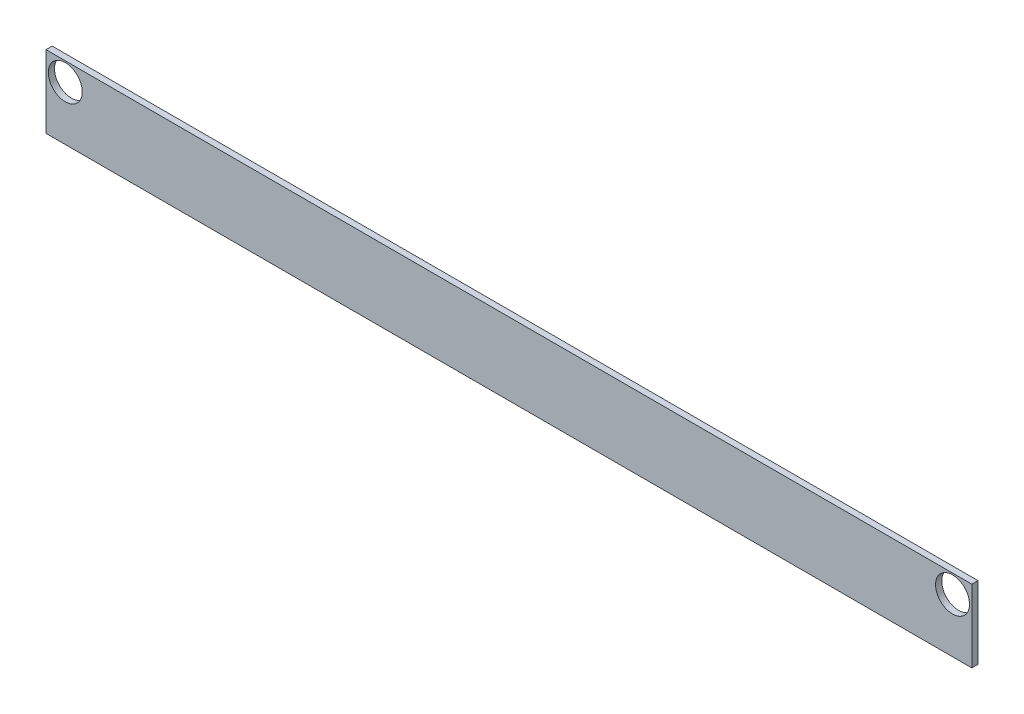
ISO-10303-21;
HEADER;
FILE_DESCRIPTION(('STEP AP214'),'2;1');
FILE_NAME('part.step','',(''),(''),'','','');
FILE_SCHEMA(('AUTOMOTIVE_DESIGN { 1 0 10303 214 1 1 1 1 }'));
ENDSEC;
DATA;
#1=APPLICATION_CONTEXT('core data for automotive mechanical design processes');
#2=APPLICATION_PROTOCOL_DEFINITION('international standard','automotive_design',2000,#1);
#3=PRODUCT_CONTEXT('',#1,'mechanical');
#4=PRODUCT('Part','Part','',(#3));
#5=PRODUCT_RELATED_PRODUCT_CATEGORY('part','',(#4));
#6=PRODUCT_DEFINITION_FORMATION('','',#4);
#7=PRODUCT_DEFINITION_CONTEXT('part definition',#1,'design');
#8=PRODUCT_DEFINITION('design','',#6,#7);
#9=PRODUCT_DEFINITION_SHAPE('','',#8);
#10=(LENGTH_UNIT() NAMED_UNIT(*) SI_UNIT(.MILLI.,.METRE.));
#11=(NAMED_UNIT(*) PLANE_ANGLE_UNIT() SI_UNIT($,.RADIAN.));
#12=(NAMED_UNIT(*) SI_UNIT($,.STERADIAN.) SOLID_ANGLE_UNIT());
#13=UNCERTAINTY_MEASURE_WITH_UNIT(LENGTH_MEASURE(1.E-05),#10,'distance_accuracy_value','');
#14=(GEOMETRIC_REPRESENTATION_CONTEXT(3) GLOBAL_UNCERTAINTY_ASSIGNED_CONTEXT((#13)) GLOBAL_UNIT_ASSIGNED_CONTEXT((#10,
#11,#12)) REPRESENTATION_CONTEXT('',''));
#15=CARTESIAN_POINT('',(0.,0.,0.));
#16=DIRECTION('',(0.,0.,1.));
#17=DIRECTION('',(1.,0.,0.));
#18=AXIS2_PLACEMENT_3D('',#15,#16,#17);
#19=CARTESIAN_POINT('',(300.,-35.,4.));
#20=DIRECTION('',(-1.,0.,0.));
#21=DIRECTION('',(0.,-1.,0.));
#22=AXIS2_PLACEMENT_3D('',#19,#20,#21);
#23=PLANE('',#22);
#24=DIRECTION('',(0.,1.,0.));
#25=VECTOR('',#24,1.);
#26=CARTESIAN_POINT('',(300.,-35.,0.));
#27=LINE('',#26,#25);
#28=CARTESIAN_POINT('',(300.,-35.,0.));
#29=VERTEX_POINT('',#28);
#30=CARTESIAN_POINT('',(300.,12.,0.));
#31=VERTEX_POINT('',#30);
#32=EDGE_CURVE('E115',#29,#31,#27,.T.);
#33=ORIENTED_EDGE('',*,*,#32,.T.);
#34=DIRECTION('',(0.,0.,-1.));
#35=VECTOR('',#34,1.);
#36=CARTESIAN_POINT('',(300.,12.,4.));
#37=LINE('',#36,#35);
#38=CARTESIAN_POINT('',(300.,12.,4.));
#39=VERTEX_POINT('',#38);
#40=EDGE_CURVE('E11',#39,#31,#37,.T.);
#41=ORIENTED_EDGE('',*,*,#40,.F.);
#42=DIRECTION('',(0.,1.,0.));
#43=VECTOR('',#42,1.);
#44=CARTESIAN_POINT('',(300.,-35.,4.));
#45=LINE('',#44,#43);
#46=CARTESIAN_POINT('',(300.,-35.,4.));
#47=VERTEX_POINT('',#46);
#48=EDGE_CURVE('E99',#47,#39,#45,.T.);
#49=ORIENTED_EDGE('',*,*,#48,.F.);
#50=DIRECTION('',(0.,0.,-1.));
#51=VECTOR('',#50,1.);
#52=CARTESIAN_POINT('',(300.,-35.,4.));
#53=LINE('',#52,#51);
#54=EDGE_CURVE('E111',#47,#29,#53,.T.);
#55=ORIENTED_EDGE('',*,*,#54,.T.);
#56=EDGE_LOOP('',(#33,#41,#49,#55));
#57=FACE_BOUND('',#56,.T.);
#58=ADVANCED_FACE('F47',(#57),#23,.F.);
#59=CARTESIAN_POINT('',(-300.,12.,4.));
#60=DIRECTION('',(0.,-1.,0.));
#61=DIRECTION('',(0.,0.,-1.));
#62=AXIS2_PLACEMENT_3D('',#59,#60,#61);
#63=PLANE('',#62);
#64=DIRECTION('',(-1.,0.,0.));
#65=VECTOR('',#64,1.);
#66=CARTESIAN_POINT('',(-300.,12.,0.));
#67=LINE('',#66,#65);
#68=CARTESIAN_POINT('',(-300.,12.,0.));
#69=VERTEX_POINT('',#68);
#70=EDGE_CURVE('E104',#31,#69,#67,.T.);
#71=ORIENTED_EDGE('',*,*,#70,.T.);
#72=DIRECTION('',(0.,0.,-1.));
#73=VECTOR('',#72,1.);
#74=CARTESIAN_POINT('',(-300.,12.,4.));
#75=LINE('',#74,#73);
#76=CARTESIAN_POINT('',(-300.,12.,4.));
#77=VERTEX_POINT('',#76);
#78=EDGE_CURVE('E56',#77,#69,#75,.T.);
#79=ORIENTED_EDGE('',*,*,#78,.F.);
#80=DIRECTION('',(-1.,0.,0.));
#81=VECTOR('',#80,1.);
#82=CARTESIAN_POINT('',(-300.,12.,4.));
#83=LINE('',#82,#81);
#84=EDGE_CURVE('E94',#39,#77,#83,.T.);
#85=ORIENTED_EDGE('',*,*,#84,.F.);
#86=ORIENTED_EDGE('',*,*,#40,.T.);
#87=EDGE_LOOP('',(#71,#79,#85,#86));
#88=FACE_BOUND('',#87,.T.);
#89=ADVANCED_FACE('F103',(#88),#63,.F.);
#90=CARTESIAN_POINT('',(-300.,-35.,4.));
#91=DIRECTION('',(1.,0.,0.));
#92=DIRECTION('',(0.,1.,0.));
#93=AXIS2_PLACEMENT_3D('',#90,#91,#92);
#94=PLANE('',#93);
#95=DIRECTION('',(0.,-1.,0.));
#96=VECTOR('',#95,1.);
#97=CARTESIAN_POINT('',(-300.,-35.,0.));
#98=LINE('',#97,#96);
#99=CARTESIAN_POINT('',(-300.,-35.,0.));
#100=VERTEX_POINT('',#99);
#101=EDGE_CURVE('E81',#69,#100,#98,.T.);
#102=ORIENTED_EDGE('',*,*,#101,.T.);
#103=DIRECTION('',(0.,0.,-1.));
#104=VECTOR('',#103,1.);
#105=CARTESIAN_POINT('',(-300.,-35.,4.));
#106=LINE('',#105,#104);
#107=CARTESIAN_POINT('',(-300.,-35.,4.));
#108=VERTEX_POINT('',#107);
#109=EDGE_CURVE('E106',#108,#100,#106,.T.);
#110=ORIENTED_EDGE('',*,*,#109,.F.);
#111=DIRECTION('',(0.,-1.,0.));
#112=VECTOR('',#111,1.);
#113=CARTESIAN_POINT('',(-300.,-35.,4.));
#114=LINE('',#113,#112);
#115=EDGE_CURVE('E97',#77,#108,#114,.T.);
#116=ORIENTED_EDGE('',*,*,#115,.F.);
#117=ORIENTED_EDGE('',*,*,#78,.T.);
#118=EDGE_LOOP('',(#102,#110,#116,#117));
#119=FACE_BOUND('',#118,.T.);
#120=ADVANCED_FACE('F107',(#119),#94,.F.);
#121=CARTESIAN_POINT('',(-300.,-35.,4.));
#122=DIRECTION('',(0.,1.,0.));
#123=DIRECTION('',(0.,0.,1.));
#124=AXIS2_PLACEMENT_3D('',#121,#122,#123);
#125=PLANE('',#124);
#126=DIRECTION('',(1.,0.,0.));
#127=VECTOR('',#126,1.);
#128=CARTESIAN_POINT('',(-300.,-35.,0.));
#129=LINE('',#128,#127);
#130=EDGE_CURVE('E87',#100,#29,#129,.T.);
#131=ORIENTED_EDGE('',*,*,#130,.T.);
#132=ORIENTED_EDGE('',*,*,#54,.F.);
#133=DIRECTION('',(1.,0.,0.));
#134=VECTOR('',#133,1.);
#135=CARTESIAN_POINT('',(-300.,-35.,4.));
#136=LINE('',#135,#134);
#137=EDGE_CURVE('E64',#108,#47,#136,.T.);
#138=ORIENTED_EDGE('',*,*,#137,.F.);
#139=ORIENTED_EDGE('',*,*,#109,.T.);
#140=EDGE_LOOP('',(#131,#132,#138,#139));
#141=FACE_BOUND('',#140,.T.);
#142=ADVANCED_FACE('F129',(#141),#125,.F.);
#143=CARTESIAN_POINT('',(0.,0.,4.));
#144=DIRECTION('',(0.,0.,-1.));
#145=DIRECTION('',(-1.,0.,0.));
#146=AXIS2_PLACEMENT_3D('',#143,#144,#145);
#147=PLANE('',#146);
#148=CARTESIAN_POINT('',(287.5,0.,4.));
#149=DIRECTION('',(0.,0.,1.));
#150=DIRECTION('',(1.,0.,0.));
#151=AXIS2_PLACEMENT_3D('',#148,#149,#150);
#152=CIRCLE('',#151,11.);
#153=CARTESIAN_POINT('',(298.5,0.,4.));
#154=VERTEX_POINT('',#153);
#155=EDGE_CURVE('E144',#154,#154,#152,.T.);
#156=ORIENTED_EDGE('',*,*,#155,.F.);
#157=EDGE_LOOP('',(#156));
#158=FACE_BOUND('',#157,.T.);
#159=CARTESIAN_POINT('',(-287.5,0.,4.));
#160=DIRECTION('',(0.,0.,1.));
#161=DIRECTION('',(-1.,0.,0.));
#162=AXIS2_PLACEMENT_3D('',#159,#160,#161);
#163=CIRCLE('',#162,11.);
#164=CARTESIAN_POINT('',(-298.5,0.,4.));
#165=VERTEX_POINT('',#164);
#166=EDGE_CURVE('E140',#165,#165,#163,.T.);
#167=ORIENTED_EDGE('',*,*,#166,.F.);
#168=EDGE_LOOP('',(#167));
#169=FACE_BOUND('',#168,.T.);
#170=ORIENTED_EDGE('',*,*,#48,.T.);
#171=ORIENTED_EDGE('',*,*,#84,.T.);
#172=ORIENTED_EDGE('',*,*,#115,.T.);
#173=ORIENTED_EDGE('',*,*,#137,.T.);
#174=EDGE_LOOP('',(#170,#171,#172,#173));
#175=FACE_BOUND('',#174,.T.);
#176=ADVANCED_FACE('F95',(#158,#169,#175),#147,.F.);
#177=CARTESIAN_POINT('',(0.,0.,0.));
#178=DIRECTION('',(0.,0.,-1.));
#179=DIRECTION('',(-1.,0.,0.));
#180=AXIS2_PLACEMENT_3D('',#177,#178,#179);
#181=PLANE('',#180);
#182=CARTESIAN_POINT('',(287.5,0.,0.));
#183=DIRECTION('',(0.,0.,1.));
#184=DIRECTION('',(1.,0.,0.));
#185=AXIS2_PLACEMENT_3D('',#182,#183,#184);
#186=CIRCLE('',#185,11.);
#187=CARTESIAN_POINT('',(298.5,0.,0.));
#188=VERTEX_POINT('',#187);
#189=EDGE_CURVE('E119',#188,#188,#186,.T.);
#190=ORIENTED_EDGE('',*,*,#189,.T.);
#191=EDGE_LOOP('',(#190));
#192=FACE_BOUND('',#191,.T.);
#193=CARTESIAN_POINT('',(-287.5,0.,0.));
#194=DIRECTION('',(0.,0.,1.));
#195=DIRECTION('',(-1.,0.,0.));
#196=AXIS2_PLACEMENT_3D('',#193,#194,#195);
#197=CIRCLE('',#196,11.);
#198=CARTESIAN_POINT('',(-298.5,0.,0.));
#199=VERTEX_POINT('',#198);
#200=EDGE_CURVE('E136',#199,#199,#197,.T.);
#201=ORIENTED_EDGE('',*,*,#200,.T.);
#202=EDGE_LOOP('',(#201));
#203=FACE_BOUND('',#202,.T.);
#204=ORIENTED_EDGE('',*,*,#32,.F.);
#205=ORIENTED_EDGE('',*,*,#130,.F.);
#206=ORIENTED_EDGE('',*,*,#101,.F.);
#207=ORIENTED_EDGE('',*,*,#70,.F.);
#208=EDGE_LOOP('',(#204,#205,#206,#207));
#209=FACE_BOUND('',#208,.T.);
#210=ADVANCED_FACE('F132',(#192,#203,#209),#181,.T.);
#211=CARTESIAN_POINT('',(-287.5,0.,0.));
#212=DIRECTION('',(0.,0.,1.));
#213=DIRECTION('',(1.,0.,0.));
#214=AXIS2_PLACEMENT_3D('',#211,#212,#213);
#215=CYLINDRICAL_SURFACE('',#214,11.);
#216=ORIENTED_EDGE('',*,*,#200,.F.);
#217=EDGE_LOOP('',(#216));
#218=FACE_BOUND('',#217,.T.);
#219=ORIENTED_EDGE('',*,*,#166,.T.);
#220=EDGE_LOOP('',(#219));
#221=FACE_BOUND('',#220,.T.);
#222=ADVANCED_FACE('F157',(#218,#221),#215,.F.);
#223=CARTESIAN_POINT('',(287.5,0.,0.));
#224=DIRECTION('',(0.,0.,1.));
#225=DIRECTION('',(1.,0.,0.));
#226=AXIS2_PLACEMENT_3D('',#223,#224,#225);
#227=CYLINDRICAL_SURFACE('',#226,11.);
#228=ORIENTED_EDGE('',*,*,#189,.F.);
#229=EDGE_LOOP('',(#228));
#230=FACE_BOUND('',#229,.T.);
#231=ORIENTED_EDGE('',*,*,#155,.T.);
#232=EDGE_LOOP('',(#231));
#233=FACE_BOUND('',#232,.T.);
#234=ADVANCED_FACE('F154',(#230,#233),#227,.F.);
#235=CLOSED_SHELL('',(#58,#89,#120,#142,#176,#210,#222,#234));
#236=MANIFOLD_SOLID_BREP('B2',#235);
#237=ADVANCED_BREP_SHAPE_REPRESENTATION('',(#18,#236),#14);
#238=SHAPE_DEFINITION_REPRESENTATION(#9,#237);
ENDSEC;
END-ISO-10303-21;
